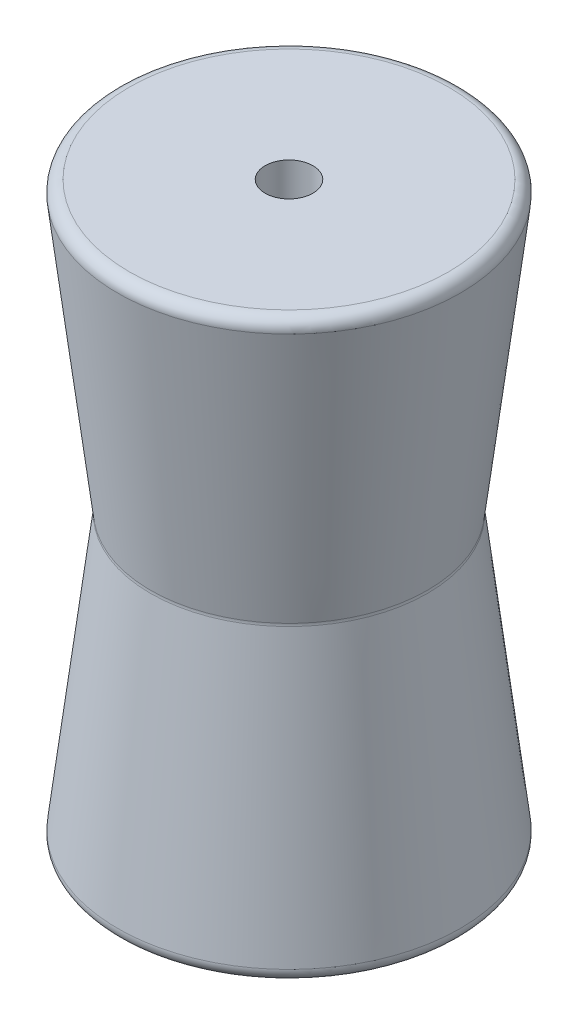
ISO-10303-21;
HEADER;
FILE_DESCRIPTION(('STEP AP214'),'2;1');
FILE_NAME('part.step','',(''),(''),'','','');
FILE_SCHEMA(('AUTOMOTIVE_DESIGN { 1 0 10303 214 1 1 1 1 }'));
ENDSEC;
DATA;
#1=APPLICATION_CONTEXT('core data for automotive mechanical design processes');
#2=APPLICATION_PROTOCOL_DEFINITION('international standard','automotive_design',2000,#1);
#3=PRODUCT_CONTEXT('',#1,'mechanical');
#4=PRODUCT('Part','Part','',(#3));
#5=PRODUCT_RELATED_PRODUCT_CATEGORY('part','',(#4));
#6=PRODUCT_DEFINITION_FORMATION('','',#4);
#7=PRODUCT_DEFINITION_CONTEXT('part definition',#1,'design');
#8=PRODUCT_DEFINITION('design','',#6,#7);
#9=PRODUCT_DEFINITION_SHAPE('','',#8);
#10=(LENGTH_UNIT() NAMED_UNIT(*) SI_UNIT(.MILLI.,.METRE.));
#11=(NAMED_UNIT(*) PLANE_ANGLE_UNIT() SI_UNIT($,.RADIAN.));
#12=(NAMED_UNIT(*) SI_UNIT($,.STERADIAN.) SOLID_ANGLE_UNIT());
#13=UNCERTAINTY_MEASURE_WITH_UNIT(LENGTH_MEASURE(1.E-05),#10,'distance_accuracy_value','');
#14=(GEOMETRIC_REPRESENTATION_CONTEXT(3) GLOBAL_UNCERTAINTY_ASSIGNED_CONTEXT((#13)) GLOBAL_UNIT_ASSIGNED_CONTEXT((#10,
#11,#12)) REPRESENTATION_CONTEXT('',''));
#15=CARTESIAN_POINT('',(0.,0.,0.));
#16=DIRECTION('',(0.,0.,1.));
#17=DIRECTION('',(1.,0.,0.));
#18=AXIS2_PLACEMENT_3D('',#15,#16,#17);
#19=CARTESIAN_POINT('',(0.,25.,0.));
#20=DIRECTION('',(0.,-1.,0.));
#21=DIRECTION('',(1.,0.,0.));
#22=AXIS2_PLACEMENT_3D('',#19,#20,#21);
#23=CONICAL_SURFACE('',#22,12.,0.119428926018339);
#24=CARTESIAN_POINT('',(0.,24.8808547793816,0.));
#25=DIRECTION('',(0.,1.,0.));
#26=DIRECTION('',(-1.,0.,0.));
#27=AXIS2_PLACEMENT_3D('',#24,#25,#26);
#28=CIRCLE('',#27,12.0142974264742);
#29=CARTESIAN_POINT('',(-12.0142974264742,24.8808547793816,0.));
#30=VERTEX_POINT('',#29);
#31=EDGE_CURVE('E48',#30,#30,#28,.F.);
#32=ORIENTED_EDGE('',*,*,#31,.T.);
#33=EDGE_LOOP('',(#32));
#34=FACE_BOUND('',#33,.T.);
#35=CARTESIAN_POINT('',(0.,1.11914522061844,0.));
#36=DIRECTION('',(0.,1.,0.));
#37=DIRECTION('',(-1.,0.,0.));
#38=AXIS2_PLACEMENT_3D('',#35,#36,#37);
#39=CIRCLE('',#38,14.8657025735258);
#40=CARTESIAN_POINT('',(-14.8657025735258,1.11914522061844,0.));
#41=VERTEX_POINT('',#40);
#42=EDGE_CURVE('E52',#41,#41,#39,.T.);
#43=ORIENTED_EDGE('',*,*,#42,.T.);
#44=EDGE_LOOP('',(#43));
#45=FACE_BOUND('',#44,.T.);
#46=ADVANCED_FACE('F41',(#34,#45),#23,.T.);
#47=CARTESIAN_POINT('',(0.,0.,0.));
#48=DIRECTION('',(0.,1.,0.));
#49=DIRECTION('',(-1.,0.,0.));
#50=AXIS2_PLACEMENT_3D('',#47,#48,#49);
#51=PLANE('',#50);
#52=CARTESIAN_POINT('',(0.,0.,0.));
#53=DIRECTION('',(0.,1.,0.));
#54=DIRECTION('',(-1.,0.,0.));
#55=AXIS2_PLACEMENT_3D('',#52,#53,#54);
#56=CIRCLE('',#55,13.8728257350389);
#57=CARTESIAN_POINT('',(-13.8728257350389,0.,0.));
#58=VERTEX_POINT('',#57);
#59=EDGE_CURVE('E10',#58,#58,#56,.F.);
#60=ORIENTED_EDGE('',*,*,#59,.T.);
#61=EDGE_LOOP('',(#60));
#62=FACE_BOUND('',#61,.T.);
#63=CARTESIAN_POINT('',(0.,0.,0.));
#64=DIRECTION('',(0.,-1.,0.));
#65=DIRECTION('',(0.,0.,-1.));
#66=AXIS2_PLACEMENT_3D('',#63,#64,#65);
#67=CIRCLE('',#66,2.075);
#68=CARTESIAN_POINT('',(0.,0.,-2.075));
#69=VERTEX_POINT('',#68);
#70=EDGE_CURVE('E70',#69,#69,#67,.T.);
#71=ORIENTED_EDGE('',*,*,#70,.F.);
#72=EDGE_LOOP('',(#71));
#73=FACE_BOUND('',#72,.T.);
#74=ADVANCED_FACE('F76',(#62,#73),#51,.F.);
#75=CARTESIAN_POINT('',(-15.,50.,0.));
#76=DIRECTION('',(0.,1.,0.));
#77=DIRECTION('',(-1.,0.,0.));
#78=AXIS2_PLACEMENT_3D('',#75,#76,#77);
#79=PLANE('',#78);
#80=CARTESIAN_POINT('',(0.,50.,0.));
#81=DIRECTION('',(0.,1.,0.));
#82=DIRECTION('',(-1.,0.,0.));
#83=AXIS2_PLACEMENT_3D('',#80,#81,#82);
#84=CIRCLE('',#83,13.8728257350389);
#85=CARTESIAN_POINT('',(-13.8728257350389,50.,0.));
#86=VERTEX_POINT('',#85);
#87=EDGE_CURVE('E56',#86,#86,#84,.T.);
#88=ORIENTED_EDGE('',*,*,#87,.T.);
#89=EDGE_LOOP('',(#88));
#90=FACE_BOUND('',#89,.T.);
#91=CARTESIAN_POINT('',(0.,50.,0.));
#92=DIRECTION('',(0.,1.,0.));
#93=DIRECTION('',(-1.,0.,0.));
#94=AXIS2_PLACEMENT_3D('',#91,#92,#93);
#95=CIRCLE('',#94,2.075);
#96=CARTESIAN_POINT('',(-2.075,50.,0.));
#97=VERTEX_POINT('',#96);
#98=EDGE_CURVE('E67',#97,#97,#95,.T.);
#99=ORIENTED_EDGE('',*,*,#98,.F.);
#100=EDGE_LOOP('',(#99));
#101=FACE_BOUND('',#100,.T.);
#102=ADVANCED_FACE('F78',(#90,#101),#79,.T.);
#103=CARTESIAN_POINT('',(0.,25.,0.));
#104=DIRECTION('',(0.,1.,0.));
#105=DIRECTION('',(-1.,0.,0.));
#106=AXIS2_PLACEMENT_3D('',#103,#104,#105);
#107=CONICAL_SURFACE('',#106,12.,0.119428926018339);
#108=CARTESIAN_POINT('',(0.,48.8808547793816,0.));
#109=DIRECTION('',(0.,-1.,0.));
#110=DIRECTION('',(1.,0.,0.));
#111=AXIS2_PLACEMENT_3D('',#108,#109,#110);
#112=CIRCLE('',#111,14.8657025735258);
#113=CARTESIAN_POINT('',(14.8657025735258,48.8808547793816,0.));
#114=VERTEX_POINT('',#113);
#115=EDGE_CURVE('E61',#114,#114,#112,.T.);
#116=ORIENTED_EDGE('',*,*,#115,.T.);
#117=EDGE_LOOP('',(#116));
#118=FACE_BOUND('',#117,.T.);
#119=CARTESIAN_POINT('',(0.,25.1191452206184,0.));
#120=DIRECTION('',(0.,-1.,0.));
#121=DIRECTION('',(1.,0.,0.));
#122=AXIS2_PLACEMENT_3D('',#119,#120,#121);
#123=CIRCLE('',#122,12.0142974264742);
#124=CARTESIAN_POINT('',(12.0142974264742,25.1191452206184,0.));
#125=VERTEX_POINT('',#124);
#126=EDGE_CURVE('E64',#125,#125,#123,.F.);
#127=ORIENTED_EDGE('',*,*,#126,.T.);
#128=EDGE_LOOP('',(#127));
#129=FACE_BOUND('',#128,.T.);
#130=ADVANCED_FACE('F84',(#118,#129),#107,.T.);
#131=CARTESIAN_POINT('',(0.,60.,0.));
#132=DIRECTION('',(0.,-1.,0.));
#133=DIRECTION('',(0.,0.,-1.));
#134=AXIS2_PLACEMENT_3D('',#131,#132,#133);
#135=CYLINDRICAL_SURFACE('',#134,2.075);
#136=ORIENTED_EDGE('',*,*,#98,.T.);
#137=EDGE_LOOP('',(#136));
#138=FACE_BOUND('',#137,.T.);
#139=ORIENTED_EDGE('',*,*,#70,.T.);
#140=EDGE_LOOP('',(#139));
#141=FACE_BOUND('',#140,.T.);
#142=ADVANCED_FACE('F74',(#138,#141),#135,.F.);
#143=CARTESIAN_POINT('',(0.,49.,0.));
#144=DIRECTION('',(0.,1.,0.));
#145=DIRECTION('',(-1.,0.,0.));
#146=AXIS2_PLACEMENT_3D('',#143,#144,#145);
#147=TOROIDAL_SURFACE('',#146,13.8728257350389,1.);
#148=ORIENTED_EDGE('',*,*,#87,.F.);
#149=EDGE_LOOP('',(#148));
#150=FACE_BOUND('',#149,.T.);
#151=ORIENTED_EDGE('',*,*,#115,.F.);
#152=EDGE_LOOP('',(#151));
#153=FACE_BOUND('',#152,.T.);
#154=ADVANCED_FACE('F93',(#150,#153),#147,.T.);
#155=CARTESIAN_POINT('',(0.,25.,0.));
#156=DIRECTION('',(0.,-1.,0.));
#157=DIRECTION('',(1.,0.,0.));
#158=AXIS2_PLACEMENT_3D('',#155,#156,#157);
#159=TOROIDAL_SURFACE('',#158,13.0071742649611,1.);
#160=ORIENTED_EDGE('',*,*,#126,.F.);
#161=EDGE_LOOP('',(#160));
#162=FACE_BOUND('',#161,.T.);
#163=ORIENTED_EDGE('',*,*,#31,.F.);
#164=EDGE_LOOP('',(#163));
#165=FACE_BOUND('',#164,.T.);
#166=ADVANCED_FACE('F95',(#162,#165),#159,.F.);
#167=CARTESIAN_POINT('',(0.,1.,0.));
#168=DIRECTION('',(0.,1.,0.));
#169=DIRECTION('',(-1.,0.,0.));
#170=AXIS2_PLACEMENT_3D('',#167,#168,#169);
#171=TOROIDAL_SURFACE('',#170,13.8728257350389,1.);
#172=ORIENTED_EDGE('',*,*,#42,.F.);
#173=EDGE_LOOP('',(#172));
#174=FACE_BOUND('',#173,.T.);
#175=ORIENTED_EDGE('',*,*,#59,.F.);
#176=EDGE_LOOP('',(#175));
#177=FACE_BOUND('',#176,.T.);
#178=ADVANCED_FACE('F43',(#174,#177),#171,.T.);
#179=CLOSED_SHELL('',(#46,#74,#102,#130,#142,#154,#166,#178));
#180=MANIFOLD_SOLID_BREP('B2',#179);
#181=ADVANCED_BREP_SHAPE_REPRESENTATION('',(#18,#180),#14);
#182=SHAPE_DEFINITION_REPRESENTATION(#9,#181);
ENDSEC;
END-ISO-10303-21;
